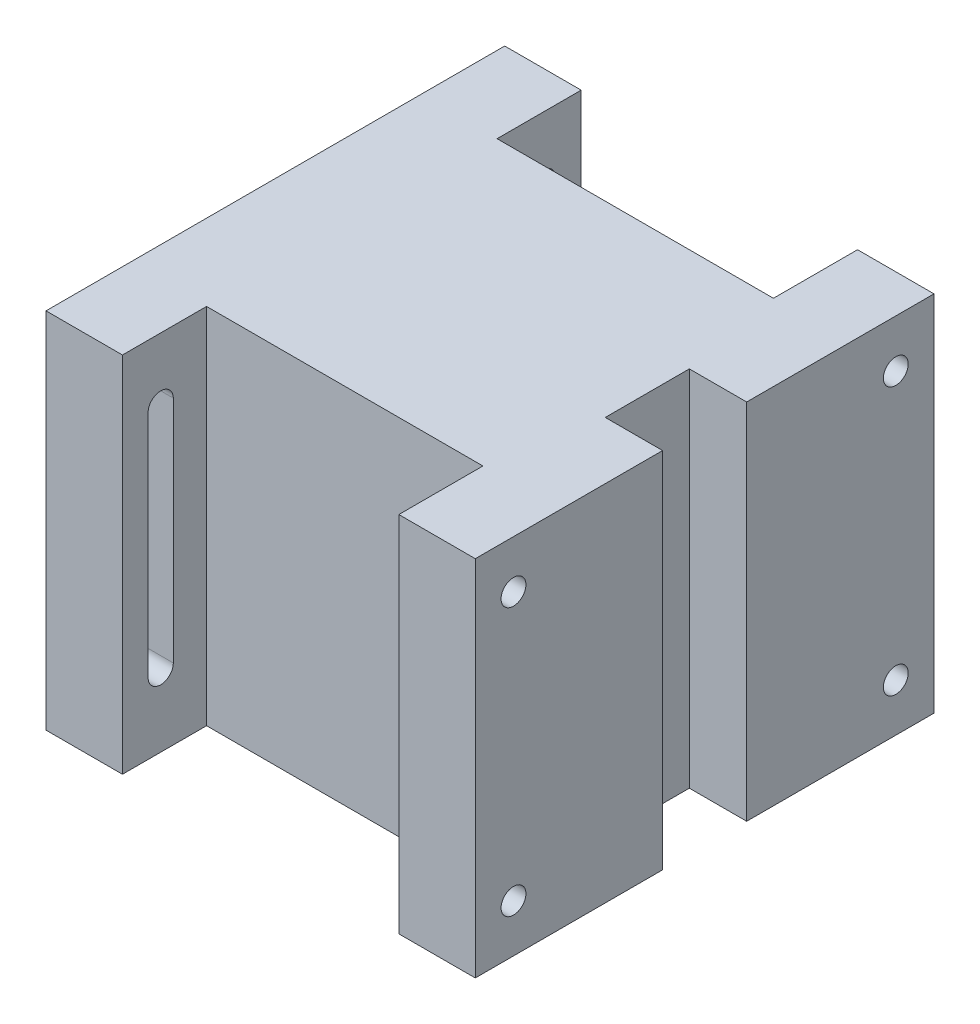
ISO-10303-21;
HEADER;
FILE_DESCRIPTION(('STEP AP214'),'2;1');
FILE_NAME('part.step','',(''),(''),'','','');
FILE_SCHEMA(('AUTOMOTIVE_DESIGN { 1 0 10303 214 1 1 1 1 }'));
ENDSEC;
DATA;
#1=APPLICATION_CONTEXT('core data for automotive mechanical design processes');
#2=APPLICATION_PROTOCOL_DEFINITION('international standard','automotive_design',2000,#1);
#3=PRODUCT_CONTEXT('',#1,'mechanical');
#4=PRODUCT('Part','Part','',(#3));
#5=PRODUCT_RELATED_PRODUCT_CATEGORY('part','',(#4));
#6=PRODUCT_DEFINITION_FORMATION('','',#4);
#7=PRODUCT_DEFINITION_CONTEXT('part definition',#1,'design');
#8=PRODUCT_DEFINITION('design','',#6,#7);
#9=PRODUCT_DEFINITION_SHAPE('','',#8);
#10=(LENGTH_UNIT() NAMED_UNIT(*) SI_UNIT(.MILLI.,.METRE.));
#11=(NAMED_UNIT(*) PLANE_ANGLE_UNIT() SI_UNIT($,.RADIAN.));
#12=(NAMED_UNIT(*) SI_UNIT($,.STERADIAN.) SOLID_ANGLE_UNIT());
#13=UNCERTAINTY_MEASURE_WITH_UNIT(LENGTH_MEASURE(1.E-05),#10,'distance_accuracy_value','');
#14=(GEOMETRIC_REPRESENTATION_CONTEXT(3) GLOBAL_UNCERTAINTY_ASSIGNED_CONTEXT((#13)) GLOBAL_UNIT_ASSIGNED_CONTEXT((#10,
#11,#12)) REPRESENTATION_CONTEXT('',''));
#15=CARTESIAN_POINT('',(0.,0.,0.));
#16=DIRECTION('',(0.,0.,1.));
#17=DIRECTION('',(1.,0.,0.));
#18=AXIS2_PLACEMENT_3D('',#15,#16,#17);
#19=CARTESIAN_POINT('',(112.3,0.,120.));
#20=DIRECTION('',(-1.,0.,0.));
#21=DIRECTION('',(0.,0.,1.));
#22=AXIS2_PLACEMENT_3D('',#19,#20,#21);
#23=PLANE('',#22);
#24=CARTESIAN_POINT('',(112.3,82.5,10.));
#25=DIRECTION('',(1.,0.,0.));
#26=DIRECTION('',(0.,0.,1.));
#27=AXIS2_PLACEMENT_3D('',#24,#25,#26);
#28=CIRCLE('',#27,3.25);
#29=CARTESIAN_POINT('',(112.3,82.5,13.25));
#30=VERTEX_POINT('',#29);
#31=EDGE_CURVE('E232',#30,#30,#28,.T.);
#32=ORIENTED_EDGE('',*,*,#31,.F.);
#33=EDGE_LOOP('',(#32));
#34=FACE_BOUND('',#33,.T.);
#35=CARTESIAN_POINT('',(112.3,12.5,9.99999999999999));
#36=DIRECTION('',(1.,0.,0.));
#37=DIRECTION('',(0.,0.,-1.));
#38=AXIS2_PLACEMENT_3D('',#35,#36,#37);
#39=CIRCLE('',#38,3.25);
#40=CARTESIAN_POINT('',(112.3,12.5,6.74999999999999));
#41=VERTEX_POINT('',#40);
#42=EDGE_CURVE('E228',#41,#41,#39,.T.);
#43=ORIENTED_EDGE('',*,*,#42,.F.);
#44=EDGE_LOOP('',(#43));
#45=FACE_BOUND('',#44,.T.);
#46=DIRECTION('',(0.,0.,-1.));
#47=VECTOR('',#46,1.);
#48=CARTESIAN_POINT('',(112.3,95.,120.));
#49=LINE('',#48,#47);
#50=CARTESIAN_POINT('',(112.3,95.,49.));
#51=VERTEX_POINT('',#50);
#52=CARTESIAN_POINT('',(112.3,95.,0.));
#53=VERTEX_POINT('',#52);
#54=EDGE_CURVE('E360',#51,#53,#49,.T.);
#55=ORIENTED_EDGE('',*,*,#54,.F.);
#56=DIRECTION('',(0.,1.,0.));
#57=VECTOR('',#56,1.);
#58=CARTESIAN_POINT('',(112.3,95.,49.));
#59=LINE('',#58,#57);
#60=CARTESIAN_POINT('',(112.3,0.,49.));
#61=VERTEX_POINT('',#60);
#62=EDGE_CURVE('E451',#61,#51,#59,.T.);
#63=ORIENTED_EDGE('',*,*,#62,.F.);
#64=DIRECTION('',(0.,0.,-1.));
#65=VECTOR('',#64,1.);
#66=CARTESIAN_POINT('',(112.3,0.,120.));
#67=LINE('',#66,#65);
#68=CARTESIAN_POINT('',(112.3,0.,0.));
#69=VERTEX_POINT('',#68);
#70=EDGE_CURVE('E362',#61,#69,#67,.T.);
#71=ORIENTED_EDGE('',*,*,#70,.T.);
#72=DIRECTION('',(0.,1.,0.));
#73=VECTOR('',#72,1.);
#74=CARTESIAN_POINT('',(112.3,0.,0.));
#75=LINE('',#74,#73);
#76=EDGE_CURVE('E352',#69,#53,#75,.T.);
#77=ORIENTED_EDGE('',*,*,#76,.T.);
#78=EDGE_LOOP('',(#55,#63,#71,#77));
#79=FACE_BOUND('',#78,.T.);
#80=ADVANCED_FACE('F33',(#34,#45,#79),#23,.F.);
#81=CARTESIAN_POINT('',(0.,95.,0.));
#82=DIRECTION('',(0.,0.,-1.));
#83=DIRECTION('',(-1.,0.,0.));
#84=AXIS2_PLACEMENT_3D('',#81,#82,#83);
#85=PLANE('',#84);
#86=DIRECTION('',(0.,-1.,0.));
#87=VECTOR('',#86,1.);
#88=CARTESIAN_POINT('',(20.,95.,0.));
#89=LINE('',#88,#87);
#90=CARTESIAN_POINT('',(20.,95.,0.));
#91=VERTEX_POINT('',#90);
#92=CARTESIAN_POINT('',(20.,0.,0.));
#93=VERTEX_POINT('',#92);
#94=EDGE_CURVE('E296',#91,#93,#89,.T.);
#95=ORIENTED_EDGE('',*,*,#94,.T.);
#96=DIRECTION('',(1.,0.,0.));
#97=VECTOR('',#96,1.);
#98=CARTESIAN_POINT('',(0.,0.,0.));
#99=LINE('',#98,#97);
#100=CARTESIAN_POINT('',(0.,0.,0.));
#101=VERTEX_POINT('',#100);
#102=EDGE_CURVE('E349',#101,#93,#99,.T.);
#103=ORIENTED_EDGE('',*,*,#102,.F.);
#104=DIRECTION('',(0.,-1.,0.));
#105=VECTOR('',#104,1.);
#106=CARTESIAN_POINT('',(0.,0.,0.));
#107=LINE('',#106,#105);
#108=CARTESIAN_POINT('',(0.,95.,0.));
#109=VERTEX_POINT('',#108);
#110=EDGE_CURVE('E324',#109,#101,#107,.T.);
#111=ORIENTED_EDGE('',*,*,#110,.F.);
#112=DIRECTION('',(-1.,0.,0.));
#113=VECTOR('',#112,1.);
#114=CARTESIAN_POINT('',(0.,95.,0.));
#115=LINE('',#114,#113);
#116=EDGE_CURVE('E355',#91,#109,#115,.T.);
#117=ORIENTED_EDGE('',*,*,#116,.F.);
#118=EDGE_LOOP('',(#95,#103,#111,#117));
#119=FACE_BOUND('',#118,.T.);
#120=ADVANCED_FACE('F415',(#119),#85,.T.);
#121=CARTESIAN_POINT('',(0.,95.,120.));
#122=DIRECTION('',(0.,0.,-1.));
#123=DIRECTION('',(-1.,0.,0.));
#124=AXIS2_PLACEMENT_3D('',#121,#122,#123);
#125=PLANE('',#124);
#126=DIRECTION('',(-1.,0.,0.));
#127=VECTOR('',#126,1.);
#128=CARTESIAN_POINT('',(0.,95.,120.));
#129=LINE('',#128,#127);
#130=CARTESIAN_POINT('',(112.3,95.,120.));
#131=VERTEX_POINT('',#130);
#132=CARTESIAN_POINT('',(92.3,95.,120.));
#133=VERTEX_POINT('',#132);
#134=EDGE_CURVE('E342',#131,#133,#129,.T.);
#135=ORIENTED_EDGE('',*,*,#134,.T.);
#136=DIRECTION('',(0.,-1.,0.));
#137=VECTOR('',#136,1.);
#138=CARTESIAN_POINT('',(92.3,95.,120.));
#139=LINE('',#138,#137);
#140=CARTESIAN_POINT('',(92.3,0.,120.));
#141=VERTEX_POINT('',#140);
#142=EDGE_CURVE('E315',#133,#141,#139,.T.);
#143=ORIENTED_EDGE('',*,*,#142,.T.);
#144=DIRECTION('',(1.,0.,0.));
#145=VECTOR('',#144,1.);
#146=CARTESIAN_POINT('',(0.,0.,120.));
#147=LINE('',#146,#145);
#148=CARTESIAN_POINT('',(112.3,0.,120.));
#149=VERTEX_POINT('',#148);
#150=EDGE_CURVE('E334',#141,#149,#147,.T.);
#151=ORIENTED_EDGE('',*,*,#150,.T.);
#152=DIRECTION('',(0.,1.,0.));
#153=VECTOR('',#152,1.);
#154=CARTESIAN_POINT('',(112.3,0.,120.));
#155=LINE('',#154,#153);
#156=EDGE_CURVE('E339',#149,#131,#155,.T.);
#157=ORIENTED_EDGE('',*,*,#156,.T.);
#158=EDGE_LOOP('',(#135,#143,#151,#157));
#159=FACE_BOUND('',#158,.T.);
#160=ADVANCED_FACE('F422',(#159),#125,.F.);
#161=CARTESIAN_POINT('',(0.,0.,120.));
#162=DIRECTION('',(1.,0.,0.));
#163=DIRECTION('',(0.,0.,-1.));
#164=AXIS2_PLACEMENT_3D('',#161,#162,#163);
#165=PLANE('',#164);
#166=DIRECTION('',(0.,1.,0.));
#167=VECTOR('',#166,1.);
#168=CARTESIAN_POINT('',(0.,18.5769602174339,13.3));
#169=LINE('',#168,#167);
#170=CARTESIAN_POINT('',(0.,18.5769602174339,13.3));
#171=VERTEX_POINT('',#170);
#172=CARTESIAN_POINT('',(0.,78.5769602174339,13.3));
#173=VERTEX_POINT('',#172);
#174=EDGE_CURVE('E241',#171,#173,#169,.T.);
#175=ORIENTED_EDGE('',*,*,#174,.F.);
#176=CARTESIAN_POINT('',(0.,18.5769602174339,9.99999999999999));
#177=DIRECTION('',(-1.,0.,0.));
#178=DIRECTION('',(0.,0.,-1.));
#179=AXIS2_PLACEMENT_3D('',#176,#177,#178);
#180=CIRCLE('',#179,3.3);
#181=CARTESIAN_POINT('',(0.,18.5769602174339,6.7));
#182=VERTEX_POINT('',#181);
#183=EDGE_CURVE('E58',#182,#171,#180,.T.);
#184=ORIENTED_EDGE('',*,*,#183,.F.);
#185=DIRECTION('',(0.,-1.,0.));
#186=VECTOR('',#185,1.);
#187=CARTESIAN_POINT('',(0.,18.5769602174339,6.7));
#188=LINE('',#187,#186);
#189=CARTESIAN_POINT('',(0.,78.5769602174339,6.7));
#190=VERTEX_POINT('',#189);
#191=EDGE_CURVE('E247',#190,#182,#188,.T.);
#192=ORIENTED_EDGE('',*,*,#191,.F.);
#193=CARTESIAN_POINT('',(0.,78.5769602174339,9.99999999999999));
#194=DIRECTION('',(-1.,0.,0.));
#195=DIRECTION('',(0.,0.,-1.));
#196=AXIS2_PLACEMENT_3D('',#193,#194,#195);
#197=CIRCLE('',#196,3.3);
#198=EDGE_CURVE('E244',#173,#190,#197,.T.);
#199=ORIENTED_EDGE('',*,*,#198,.F.);
#200=EDGE_LOOP('',(#175,#184,#192,#199));
#201=FACE_BOUND('',#200,.T.);
#202=DIRECTION('',(0.,1.,0.));
#203=VECTOR('',#202,1.);
#204=CARTESIAN_POINT('',(0.,18.5769602174339,113.3));
#205=LINE('',#204,#203);
#206=CARTESIAN_POINT('',(0.,18.5769602174339,113.3));
#207=VERTEX_POINT('',#206);
#208=CARTESIAN_POINT('',(0.,78.5769602174339,113.3));
#209=VERTEX_POINT('',#208);
#210=EDGE_CURVE('E260',#207,#209,#205,.T.);
#211=ORIENTED_EDGE('',*,*,#210,.F.);
#212=CARTESIAN_POINT('',(0.,18.5769602174339,110.));
#213=DIRECTION('',(-1.,0.,0.));
#214=DIRECTION('',(0.,0.,1.));
#215=AXIS2_PLACEMENT_3D('',#212,#213,#214);
#216=CIRCLE('',#215,3.3);
#217=CARTESIAN_POINT('',(0.,18.5769602174339,106.7));
#218=VERTEX_POINT('',#217);
#219=EDGE_CURVE('E253',#218,#207,#216,.T.);
#220=ORIENTED_EDGE('',*,*,#219,.F.);
#221=DIRECTION('',(0.,-1.,0.));
#222=VECTOR('',#221,1.);
#223=CARTESIAN_POINT('',(0.,18.5769602174339,106.7));
#224=LINE('',#223,#222);
#225=CARTESIAN_POINT('',(0.,78.5769602174339,106.7));
#226=VERTEX_POINT('',#225);
#227=EDGE_CURVE('E266',#226,#218,#224,.T.);
#228=ORIENTED_EDGE('',*,*,#227,.F.);
#229=CARTESIAN_POINT('',(0.,78.5769602174339,110.));
#230=DIRECTION('',(-1.,0.,0.));
#231=DIRECTION('',(0.,0.,1.));
#232=AXIS2_PLACEMENT_3D('',#229,#230,#231);
#233=CIRCLE('',#232,3.3);
#234=EDGE_CURVE('E263',#209,#226,#233,.T.);
#235=ORIENTED_EDGE('',*,*,#234,.F.);
#236=EDGE_LOOP('',(#211,#220,#228,#235));
#237=FACE_BOUND('',#236,.T.);
#238=ORIENTED_EDGE('',*,*,#110,.T.);
#239=DIRECTION('',(0.,0.,-1.));
#240=VECTOR('',#239,1.);
#241=CARTESIAN_POINT('',(0.,0.,120.));
#242=LINE('',#241,#240);
#243=CARTESIAN_POINT('',(0.,0.,120.));
#244=VERTEX_POINT('',#243);
#245=EDGE_CURVE('E366',#244,#101,#242,.T.);
#246=ORIENTED_EDGE('',*,*,#245,.F.);
#247=DIRECTION('',(0.,-1.,0.));
#248=VECTOR('',#247,1.);
#249=CARTESIAN_POINT('',(0.,0.,120.));
#250=LINE('',#249,#248);
#251=CARTESIAN_POINT('',(0.,95.,120.));
#252=VERTEX_POINT('',#251);
#253=EDGE_CURVE('E331',#252,#244,#250,.T.);
#254=ORIENTED_EDGE('',*,*,#253,.F.);
#255=DIRECTION('',(0.,0.,-1.));
#256=VECTOR('',#255,1.);
#257=CARTESIAN_POINT('',(0.,95.,120.));
#258=LINE('',#257,#256);
#259=EDGE_CURVE('E345',#252,#109,#258,.T.);
#260=ORIENTED_EDGE('',*,*,#259,.T.);
#261=EDGE_LOOP('',(#238,#246,#254,#260));
#262=FACE_BOUND('',#261,.T.);
#263=ADVANCED_FACE('F35',(#201,#237,#262),#165,.F.);
#264=CARTESIAN_POINT('',(0.,0.,120.));
#265=DIRECTION('',(0.,1.,0.));
#266=DIRECTION('',(0.,0.,1.));
#267=AXIS2_PLACEMENT_3D('',#264,#265,#266);
#268=PLANE('',#267);
#269=ORIENTED_EDGE('',*,*,#70,.F.);
#270=DIRECTION('',(1.,0.,0.));
#271=VECTOR('',#270,1.);
#272=CARTESIAN_POINT('',(97.3,0.,49.));
#273=LINE('',#272,#271);
#274=CARTESIAN_POINT('',(97.3,0.,49.));
#275=VERTEX_POINT('',#274);
#276=EDGE_CURVE('E220',#275,#61,#273,.T.);
#277=ORIENTED_EDGE('',*,*,#276,.F.);
#278=DIRECTION('',(0.,0.,-1.));
#279=VECTOR('',#278,1.);
#280=CARTESIAN_POINT('',(97.3,0.,49.));
#281=LINE('',#280,#279);
#282=CARTESIAN_POINT('',(97.3,0.,71.));
#283=VERTEX_POINT('',#282);
#284=EDGE_CURVE('E205',#283,#275,#281,.T.);
#285=ORIENTED_EDGE('',*,*,#284,.F.);
#286=DIRECTION('',(1.,0.,0.));
#287=VECTOR('',#286,1.);
#288=CARTESIAN_POINT('',(97.3,0.,71.));
#289=LINE('',#288,#287);
#290=CARTESIAN_POINT('',(112.3,0.,71.));
#291=VERTEX_POINT('',#290);
#292=EDGE_CURVE('E203',#283,#291,#289,.T.);
#293=ORIENTED_EDGE('',*,*,#292,.T.);
#294=EDGE_CURVE('E363',#149,#291,#67,.T.);
#295=ORIENTED_EDGE('',*,*,#294,.F.);
#296=ORIENTED_EDGE('',*,*,#150,.F.);
#297=DIRECTION('',(0.,0.,1.));
#298=VECTOR('',#297,1.);
#299=CARTESIAN_POINT('',(92.3,0.,120.));
#300=LINE('',#299,#298);
#301=CARTESIAN_POINT('',(92.3,0.,98.));
#302=VERTEX_POINT('',#301);
#303=EDGE_CURVE('E299',#302,#141,#300,.T.);
#304=ORIENTED_EDGE('',*,*,#303,.F.);
#305=DIRECTION('',(1.,0.,0.));
#306=VECTOR('',#305,1.);
#307=CARTESIAN_POINT('',(92.3,0.,98.));
#308=LINE('',#307,#306);
#309=CARTESIAN_POINT('',(20.,0.,98.));
#310=VERTEX_POINT('',#309);
#311=EDGE_CURVE('E309',#310,#302,#308,.T.);
#312=ORIENTED_EDGE('',*,*,#311,.F.);
#313=DIRECTION('',(0.,0.,-1.));
#314=VECTOR('',#313,1.);
#315=CARTESIAN_POINT('',(20.,0.,120.));
#316=LINE('',#315,#314);
#317=CARTESIAN_POINT('',(20.,0.,120.));
#318=VERTEX_POINT('',#317);
#319=EDGE_CURVE('E317',#318,#310,#316,.T.);
#320=ORIENTED_EDGE('',*,*,#319,.F.);
#321=EDGE_CURVE('E336',#244,#318,#147,.T.);
#322=ORIENTED_EDGE('',*,*,#321,.F.);
#323=ORIENTED_EDGE('',*,*,#245,.T.);
#324=ORIENTED_EDGE('',*,*,#102,.T.);
#325=DIRECTION('',(0.,0.,-1.));
#326=VECTOR('',#325,1.);
#327=CARTESIAN_POINT('',(20.,0.,0.));
#328=LINE('',#327,#326);
#329=CARTESIAN_POINT('',(20.,0.,22.));
#330=VERTEX_POINT('',#329);
#331=EDGE_CURVE('E283',#330,#93,#328,.T.);
#332=ORIENTED_EDGE('',*,*,#331,.F.);
#333=DIRECTION('',(-1.,0.,0.));
#334=VECTOR('',#333,1.);
#335=CARTESIAN_POINT('',(92.3,0.,22.));
#336=LINE('',#335,#334);
#337=CARTESIAN_POINT('',(92.3,0.,22.));
#338=VERTEX_POINT('',#337);
#339=EDGE_CURVE('E292',#338,#330,#336,.T.);
#340=ORIENTED_EDGE('',*,*,#339,.F.);
#341=DIRECTION('',(0.,0.,1.));
#342=VECTOR('',#341,1.);
#343=CARTESIAN_POINT('',(92.3,0.,0.));
#344=LINE('',#343,#342);
#345=CARTESIAN_POINT('',(92.3,0.,0.));
#346=VERTEX_POINT('',#345);
#347=EDGE_CURVE('E272',#346,#338,#344,.T.);
#348=ORIENTED_EDGE('',*,*,#347,.F.);
#349=EDGE_CURVE('E348',#346,#69,#99,.T.);
#350=ORIENTED_EDGE('',*,*,#349,.T.);
#351=EDGE_LOOP('',(#269,#277,#285,#293,#295,#296,#304,#312,#320,#322,#323,#324,#332,#340,#348,#350));
#352=FACE_BOUND('',#351,.T.);
#353=ADVANCED_FACE('F430',(#352),#268,.F.);
#354=CARTESIAN_POINT('',(112.3,12.5,110.));
#355=DIRECTION('',(1.,0.,0.));
#356=DIRECTION('',(0.,0.,1.));
#357=AXIS2_PLACEMENT_3D('',#354,#355,#356);
#358=CIRCLE('',#357,3.25000000000001);
#359=CARTESIAN_POINT('',(112.3,12.5,113.25));
#360=VERTEX_POINT('',#359);
#361=EDGE_CURVE('E225',#360,#360,#358,.T.);
#362=ORIENTED_EDGE('',*,*,#361,.F.);
#363=EDGE_LOOP('',(#362));
#364=FACE_BOUND('',#363,.T.);
#365=CARTESIAN_POINT('',(112.3,82.5,110.));
#366=DIRECTION('',(1.,0.,0.));
#367=DIRECTION('',(0.,0.,-1.));
#368=AXIS2_PLACEMENT_3D('',#365,#366,#367);
#369=CIRCLE('',#368,3.25000000000001);
#370=CARTESIAN_POINT('',(112.3,82.5,106.75));
#371=VERTEX_POINT('',#370);
#372=EDGE_CURVE('E236',#371,#371,#369,.T.);
#373=ORIENTED_EDGE('',*,*,#372,.F.);
#374=EDGE_LOOP('',(#373));
#375=FACE_BOUND('',#374,.T.);
#376=ORIENTED_EDGE('',*,*,#294,.T.);
#377=DIRECTION('',(0.,-1.,0.));
#378=VECTOR('',#377,1.);
#379=CARTESIAN_POINT('',(112.3,95.,71.));
#380=LINE('',#379,#378);
#381=CARTESIAN_POINT('',(112.3,95.,71.));
#382=VERTEX_POINT('',#381);
#383=EDGE_CURVE('E444',#382,#291,#380,.T.);
#384=ORIENTED_EDGE('',*,*,#383,.F.);
#385=EDGE_CURVE('E217',#131,#382,#49,.T.);
#386=ORIENTED_EDGE('',*,*,#385,.F.);
#387=ORIENTED_EDGE('',*,*,#156,.F.);
#388=EDGE_LOOP('',(#376,#384,#386,#387));
#389=FACE_BOUND('',#388,.T.);
#390=ADVANCED_FACE('F418',(#364,#375,#389),#23,.F.);
#391=CARTESIAN_POINT('',(0.,95.,120.));
#392=DIRECTION('',(0.,-1.,0.));
#393=DIRECTION('',(0.,0.,-1.));
#394=AXIS2_PLACEMENT_3D('',#391,#392,#393);
#395=PLANE('',#394);
#396=DIRECTION('',(0.,0.,1.));
#397=VECTOR('',#396,1.);
#398=CARTESIAN_POINT('',(97.3,95.,49.));
#399=LINE('',#398,#397);
#400=CARTESIAN_POINT('',(97.3,95.,49.));
#401=VERTEX_POINT('',#400);
#402=CARTESIAN_POINT('',(97.3,95.,71.));
#403=VERTEX_POINT('',#402);
#404=EDGE_CURVE('E206',#401,#403,#399,.T.);
#405=ORIENTED_EDGE('',*,*,#404,.F.);
#406=DIRECTION('',(1.,0.,0.));
#407=VECTOR('',#406,1.);
#408=CARTESIAN_POINT('',(97.3,95.,49.));
#409=LINE('',#408,#407);
#410=EDGE_CURVE('E218',#401,#51,#409,.T.);
#411=ORIENTED_EDGE('',*,*,#410,.T.);
#412=ORIENTED_EDGE('',*,*,#54,.T.);
#413=CARTESIAN_POINT('',(92.3,95.,0.));
#414=VERTEX_POINT('',#413);
#415=EDGE_CURVE('E335',#53,#414,#115,.T.);
#416=ORIENTED_EDGE('',*,*,#415,.T.);
#417=DIRECTION('',(0.,0.,1.));
#418=VECTOR('',#417,1.);
#419=CARTESIAN_POINT('',(92.3,95.,0.));
#420=LINE('',#419,#418);
#421=CARTESIAN_POINT('',(92.3,95.,22.));
#422=VERTEX_POINT('',#421);
#423=EDGE_CURVE('E279',#414,#422,#420,.T.);
#424=ORIENTED_EDGE('',*,*,#423,.T.);
#425=DIRECTION('',(-1.,0.,0.));
#426=VECTOR('',#425,1.);
#427=CARTESIAN_POINT('',(92.3,95.,22.));
#428=LINE('',#427,#426);
#429=CARTESIAN_POINT('',(20.,95.,22.));
#430=VERTEX_POINT('',#429);
#431=EDGE_CURVE('E282',#422,#430,#428,.T.);
#432=ORIENTED_EDGE('',*,*,#431,.T.);
#433=DIRECTION('',(0.,0.,-1.));
#434=VECTOR('',#433,1.);
#435=CARTESIAN_POINT('',(20.,95.,0.));
#436=LINE('',#435,#434);
#437=EDGE_CURVE('E286',#430,#91,#436,.T.);
#438=ORIENTED_EDGE('',*,*,#437,.T.);
#439=ORIENTED_EDGE('',*,*,#116,.T.);
#440=ORIENTED_EDGE('',*,*,#259,.F.);
#441=CARTESIAN_POINT('',(20.,95.,120.));
#442=VERTEX_POINT('',#441);
#443=EDGE_CURVE('E341',#442,#252,#129,.T.);
#444=ORIENTED_EDGE('',*,*,#443,.F.);
#445=DIRECTION('',(0.,0.,-1.));
#446=VECTOR('',#445,1.);
#447=CARTESIAN_POINT('',(20.,95.,120.));
#448=LINE('',#447,#446);
#449=CARTESIAN_POINT('',(20.,95.,98.));
#450=VERTEX_POINT('',#449);
#451=EDGE_CURVE('E308',#442,#450,#448,.T.);
#452=ORIENTED_EDGE('',*,*,#451,.T.);
#453=DIRECTION('',(1.,0.,0.));
#454=VECTOR('',#453,1.);
#455=CARTESIAN_POINT('',(92.3,95.,98.));
#456=LINE('',#455,#454);
#457=CARTESIAN_POINT('',(92.3,95.,98.));
#458=VERTEX_POINT('',#457);
#459=EDGE_CURVE('E312',#450,#458,#456,.T.);
#460=ORIENTED_EDGE('',*,*,#459,.T.);
#461=DIRECTION('',(0.,0.,1.));
#462=VECTOR('',#461,1.);
#463=CARTESIAN_POINT('',(92.3,95.,120.));
#464=LINE('',#463,#462);
#465=EDGE_CURVE('E305',#458,#133,#464,.T.);
#466=ORIENTED_EDGE('',*,*,#465,.T.);
#467=ORIENTED_EDGE('',*,*,#134,.F.);
#468=ORIENTED_EDGE('',*,*,#385,.T.);
#469=DIRECTION('',(1.,0.,0.));
#470=VECTOR('',#469,1.);
#471=CARTESIAN_POINT('',(97.3,95.,71.));
#472=LINE('',#471,#470);
#473=EDGE_CURVE('E200',#403,#382,#472,.T.);
#474=ORIENTED_EDGE('',*,*,#473,.F.);
#475=EDGE_LOOP('',(#405,#411,#412,#416,#424,#432,#438,#439,#440,#444,#452,#460,#466,#467,#468,#474));
#476=FACE_BOUND('',#475,.T.);
#477=ADVANCED_FACE('F214',(#476),#395,.F.);
#478=ORIENTED_EDGE('',*,*,#321,.T.);
#479=DIRECTION('',(0.,-1.,0.));
#480=VECTOR('',#479,1.);
#481=CARTESIAN_POINT('',(20.,95.,120.));
#482=LINE('',#481,#480);
#483=EDGE_CURVE('E327',#442,#318,#482,.T.);
#484=ORIENTED_EDGE('',*,*,#483,.F.);
#485=ORIENTED_EDGE('',*,*,#443,.T.);
#486=ORIENTED_EDGE('',*,*,#253,.T.);
#487=EDGE_LOOP('',(#478,#484,#485,#486));
#488=FACE_BOUND('',#487,.T.);
#489=ADVANCED_FACE('F436',(#488),#125,.F.);
#490=DIRECTION('',(0.,-1.,0.));
#491=VECTOR('',#490,1.);
#492=CARTESIAN_POINT('',(92.3,95.,0.));
#493=LINE('',#492,#491);
#494=EDGE_CURVE('E289',#414,#346,#493,.T.);
#495=ORIENTED_EDGE('',*,*,#494,.F.);
#496=ORIENTED_EDGE('',*,*,#415,.F.);
#497=ORIENTED_EDGE('',*,*,#76,.F.);
#498=ORIENTED_EDGE('',*,*,#349,.F.);
#499=EDGE_LOOP('',(#495,#496,#497,#498));
#500=FACE_BOUND('',#499,.T.);
#501=ADVANCED_FACE('F425',(#500),#85,.T.);
#502=CARTESIAN_POINT('',(92.3,95.,120.));
#503=DIRECTION('',(1.,0.,0.));
#504=DIRECTION('',(0.,0.,-1.));
#505=AXIS2_PLACEMENT_3D('',#502,#503,#504);
#506=PLANE('',#505);
#507=CARTESIAN_POINT('',(92.3,12.5,110.));
#508=DIRECTION('',(1.,0.,0.));
#509=DIRECTION('',(0.,0.,-1.));
#510=AXIS2_PLACEMENT_3D('',#507,#508,#509);
#511=CIRCLE('',#510,3.25000000000001);
#512=CARTESIAN_POINT('',(92.3,12.5,106.75));
#513=VERTEX_POINT('',#512);
#514=EDGE_CURVE('E37',#513,#513,#511,.T.);
#515=ORIENTED_EDGE('',*,*,#514,.T.);
#516=EDGE_LOOP('',(#515));
#517=FACE_BOUND('',#516,.T.);
#518=CARTESIAN_POINT('',(92.3,82.5,110.));
#519=DIRECTION('',(1.,0.,0.));
#520=DIRECTION('',(0.,0.,-1.));
#521=AXIS2_PLACEMENT_3D('',#518,#519,#520);
#522=CIRCLE('',#521,3.25000000000001);
#523=CARTESIAN_POINT('',(92.3,82.5,106.75));
#524=VERTEX_POINT('',#523);
#525=EDGE_CURVE('E239',#524,#524,#522,.T.);
#526=ORIENTED_EDGE('',*,*,#525,.T.);
#527=EDGE_LOOP('',(#526));
#528=FACE_BOUND('',#527,.T.);
#529=ORIENTED_EDGE('',*,*,#303,.T.);
#530=ORIENTED_EDGE('',*,*,#142,.F.);
#531=ORIENTED_EDGE('',*,*,#465,.F.);
#532=DIRECTION('',(0.,-1.,0.));
#533=VECTOR('',#532,1.);
#534=CARTESIAN_POINT('',(92.3,95.,98.));
#535=LINE('',#534,#533);
#536=EDGE_CURVE('E322',#458,#302,#535,.T.);
#537=ORIENTED_EDGE('',*,*,#536,.T.);
#538=EDGE_LOOP('',(#529,#530,#531,#537));
#539=FACE_BOUND('',#538,.T.);
#540=ADVANCED_FACE('F492',(#517,#528,#539),#506,.F.);
#541=CARTESIAN_POINT('',(92.3,95.,98.));
#542=DIRECTION('',(0.,0.,-1.));
#543=DIRECTION('',(-1.,0.,0.));
#544=AXIS2_PLACEMENT_3D('',#541,#542,#543);
#545=PLANE('',#544);
#546=ORIENTED_EDGE('',*,*,#311,.T.);
#547=ORIENTED_EDGE('',*,*,#536,.F.);
#548=ORIENTED_EDGE('',*,*,#459,.F.);
#549=DIRECTION('',(0.,-1.,0.));
#550=VECTOR('',#549,1.);
#551=CARTESIAN_POINT('',(20.,95.,98.));
#552=LINE('',#551,#550);
#553=EDGE_CURVE('E325',#450,#310,#552,.T.);
#554=ORIENTED_EDGE('',*,*,#553,.T.);
#555=EDGE_LOOP('',(#546,#547,#548,#554));
#556=FACE_BOUND('',#555,.T.);
#557=ADVANCED_FACE('F487',(#556),#545,.F.);
#558=CARTESIAN_POINT('',(20.,95.,120.));
#559=DIRECTION('',(-1.,0.,0.));
#560=DIRECTION('',(0.,0.,1.));
#561=AXIS2_PLACEMENT_3D('',#558,#559,#560);
#562=PLANE('',#561);
#563=DIRECTION('',(0.,-1.,0.));
#564=VECTOR('',#563,1.);
#565=CARTESIAN_POINT('',(20.,95.,106.7));
#566=LINE('',#565,#564);
#567=CARTESIAN_POINT('',(20.,78.5769602174339,106.7));
#568=VERTEX_POINT('',#567);
#569=CARTESIAN_POINT('',(20.,18.5769602174339,106.7));
#570=VERTEX_POINT('',#569);
#571=EDGE_CURVE('E375',#568,#570,#566,.T.);
#572=ORIENTED_EDGE('',*,*,#571,.T.);
#573=CARTESIAN_POINT('',(20.,18.5769602174339,110.));
#574=DIRECTION('',(-1.,0.,0.));
#575=DIRECTION('',(0.,0.,1.));
#576=AXIS2_PLACEMENT_3D('',#573,#574,#575);
#577=CIRCLE('',#576,3.3);
#578=CARTESIAN_POINT('',(20.,18.5769602174339,113.3));
#579=VERTEX_POINT('',#578);
#580=EDGE_CURVE('E378',#570,#579,#577,.T.);
#581=ORIENTED_EDGE('',*,*,#580,.T.);
#582=DIRECTION('',(0.,1.,0.));
#583=VECTOR('',#582,1.);
#584=CARTESIAN_POINT('',(20.,95.,113.3));
#585=LINE('',#584,#583);
#586=CARTESIAN_POINT('',(20.,78.5769602174339,113.3));
#587=VERTEX_POINT('',#586);
#588=EDGE_CURVE('E369',#579,#587,#585,.T.);
#589=ORIENTED_EDGE('',*,*,#588,.T.);
#590=CARTESIAN_POINT('',(20.,78.5769602174339,110.));
#591=DIRECTION('',(-1.,0.,0.));
#592=DIRECTION('',(0.,0.,1.));
#593=AXIS2_PLACEMENT_3D('',#590,#591,#592);
#594=CIRCLE('',#593,3.3);
#595=EDGE_CURVE('E372',#587,#568,#594,.T.);
#596=ORIENTED_EDGE('',*,*,#595,.T.);
#597=EDGE_LOOP('',(#572,#581,#589,#596));
#598=FACE_BOUND('',#597,.T.);
#599=ORIENTED_EDGE('',*,*,#319,.T.);
#600=ORIENTED_EDGE('',*,*,#553,.F.);
#601=ORIENTED_EDGE('',*,*,#451,.F.);
#602=ORIENTED_EDGE('',*,*,#483,.T.);
#603=EDGE_LOOP('',(#599,#600,#601,#602));
#604=FACE_BOUND('',#603,.T.);
#605=ADVANCED_FACE('F484',(#598,#604),#562,.F.);
#606=CARTESIAN_POINT('',(20.,95.,0.));
#607=DIRECTION('',(-1.,0.,0.));
#608=DIRECTION('',(0.,0.,1.));
#609=AXIS2_PLACEMENT_3D('',#606,#607,#608);
#610=PLANE('',#609);
#611=DIRECTION('',(0.,-1.,0.));
#612=VECTOR('',#611,1.);
#613=CARTESIAN_POINT('',(20.,95.,6.7));
#614=LINE('',#613,#612);
#615=CARTESIAN_POINT('',(20.,78.5769602174339,6.7));
#616=VERTEX_POINT('',#615);
#617=CARTESIAN_POINT('',(20.,18.5769602174339,6.7));
#618=VERTEX_POINT('',#617);
#619=EDGE_CURVE('E42',#616,#618,#614,.T.);
#620=ORIENTED_EDGE('',*,*,#619,.T.);
#621=CARTESIAN_POINT('',(20.,18.5769602174339,9.99999999999999));
#622=DIRECTION('',(-1.,0.,0.));
#623=DIRECTION('',(0.,0.,1.));
#624=AXIS2_PLACEMENT_3D('',#621,#622,#623);
#625=CIRCLE('',#624,3.3);
#626=CARTESIAN_POINT('',(20.,18.5769602174339,13.3));
#627=VERTEX_POINT('',#626);
#628=EDGE_CURVE('E11',#618,#627,#625,.T.);
#629=ORIENTED_EDGE('',*,*,#628,.T.);
#630=DIRECTION('',(0.,1.,0.));
#631=VECTOR('',#630,1.);
#632=CARTESIAN_POINT('',(20.,95.,13.3));
#633=LINE('',#632,#631);
#634=CARTESIAN_POINT('',(20.,78.5769602174339,13.3));
#635=VERTEX_POINT('',#634);
#636=EDGE_CURVE('E381',#627,#635,#633,.T.);
#637=ORIENTED_EDGE('',*,*,#636,.T.);
#638=CARTESIAN_POINT('',(20.,78.5769602174339,9.99999999999999));
#639=DIRECTION('',(-1.,0.,0.));
#640=DIRECTION('',(0.,0.,1.));
#641=AXIS2_PLACEMENT_3D('',#638,#639,#640);
#642=CIRCLE('',#641,3.3);
#643=EDGE_CURVE('E384',#635,#616,#642,.T.);
#644=ORIENTED_EDGE('',*,*,#643,.T.);
#645=EDGE_LOOP('',(#620,#629,#637,#644));
#646=FACE_BOUND('',#645,.T.);
#647=ORIENTED_EDGE('',*,*,#331,.T.);
#648=ORIENTED_EDGE('',*,*,#94,.F.);
#649=ORIENTED_EDGE('',*,*,#437,.F.);
#650=DIRECTION('',(0.,-1.,0.));
#651=VECTOR('',#650,1.);
#652=CARTESIAN_POINT('',(20.,95.,22.));
#653=LINE('',#652,#651);
#654=EDGE_CURVE('E300',#430,#330,#653,.T.);
#655=ORIENTED_EDGE('',*,*,#654,.T.);
#656=EDGE_LOOP('',(#647,#648,#649,#655));
#657=FACE_BOUND('',#656,.T.);
#658=ADVANCED_FACE('F472',(#646,#657),#610,.F.);
#659=CARTESIAN_POINT('',(92.3,95.,22.));
#660=DIRECTION('',(0.,0.,1.));
#661=DIRECTION('',(1.,0.,0.));
#662=AXIS2_PLACEMENT_3D('',#659,#660,#661);
#663=PLANE('',#662);
#664=ORIENTED_EDGE('',*,*,#339,.T.);
#665=ORIENTED_EDGE('',*,*,#654,.F.);
#666=ORIENTED_EDGE('',*,*,#431,.F.);
#667=DIRECTION('',(0.,-1.,0.));
#668=VECTOR('',#667,1.);
#669=CARTESIAN_POINT('',(92.3,95.,22.));
#670=LINE('',#669,#668);
#671=EDGE_CURVE('E302',#422,#338,#670,.T.);
#672=ORIENTED_EDGE('',*,*,#671,.T.);
#673=EDGE_LOOP('',(#664,#665,#666,#672));
#674=FACE_BOUND('',#673,.T.);
#675=ADVANCED_FACE('F468',(#674),#663,.F.);
#676=CARTESIAN_POINT('',(92.3,95.,0.));
#677=DIRECTION('',(1.,0.,0.));
#678=DIRECTION('',(0.,0.,-1.));
#679=AXIS2_PLACEMENT_3D('',#676,#677,#678);
#680=PLANE('',#679);
#681=CARTESIAN_POINT('',(92.3,12.5,9.99999999999999));
#682=DIRECTION('',(1.,0.,0.));
#683=DIRECTION('',(0.,0.,-1.));
#684=AXIS2_PLACEMENT_3D('',#681,#682,#683);
#685=CIRCLE('',#684,3.25);
#686=CARTESIAN_POINT('',(92.3,12.5,6.74999999999999));
#687=VERTEX_POINT('',#686);
#688=EDGE_CURVE('E231',#687,#687,#685,.T.);
#689=ORIENTED_EDGE('',*,*,#688,.T.);
#690=EDGE_LOOP('',(#689));
#691=FACE_BOUND('',#690,.T.);
#692=CARTESIAN_POINT('',(92.3,82.5,10.));
#693=DIRECTION('',(1.,0.,0.));
#694=DIRECTION('',(0.,0.,-1.));
#695=AXIS2_PLACEMENT_3D('',#692,#693,#694);
#696=CIRCLE('',#695,3.25);
#697=CARTESIAN_POINT('',(92.3,82.5,6.75));
#698=VERTEX_POINT('',#697);
#699=EDGE_CURVE('E235',#698,#698,#696,.T.);
#700=ORIENTED_EDGE('',*,*,#699,.T.);
#701=EDGE_LOOP('',(#700));
#702=FACE_BOUND('',#701,.T.);
#703=ORIENTED_EDGE('',*,*,#347,.T.);
#704=ORIENTED_EDGE('',*,*,#671,.F.);
#705=ORIENTED_EDGE('',*,*,#423,.F.);
#706=ORIENTED_EDGE('',*,*,#494,.T.);
#707=EDGE_LOOP('',(#703,#704,#705,#706));
#708=FACE_BOUND('',#707,.T.);
#709=ADVANCED_FACE('F395',(#691,#702,#708),#680,.F.);
#710=CARTESIAN_POINT('',(25.,18.5769602174339,110.));
#711=DIRECTION('',(-1.,0.,0.));
#712=DIRECTION('',(0.,0.,1.));
#713=AXIS2_PLACEMENT_3D('',#710,#711,#712);
#714=CYLINDRICAL_SURFACE('',#713,3.3);
#715=DIRECTION('',(-1.,0.,0.));
#716=VECTOR('',#715,1.);
#717=CARTESIAN_POINT('',(25.,18.5769602174339,106.7));
#718=LINE('',#717,#716);
#719=EDGE_CURVE('E270',#570,#218,#718,.T.);
#720=ORIENTED_EDGE('',*,*,#719,.T.);
#721=ORIENTED_EDGE('',*,*,#219,.T.);
#722=DIRECTION('',(-1.,0.,0.));
#723=VECTOR('',#722,1.);
#724=CARTESIAN_POINT('',(25.,18.5769602174339,113.3));
#725=LINE('',#724,#723);
#726=EDGE_CURVE('E269',#579,#207,#725,.T.);
#727=ORIENTED_EDGE('',*,*,#726,.F.);
#728=ORIENTED_EDGE('',*,*,#580,.F.);
#729=EDGE_LOOP('',(#720,#721,#727,#728));
#730=FACE_BOUND('',#729,.T.);
#731=ADVANCED_FACE('F527',(#730),#714,.F.);
#732=CARTESIAN_POINT('',(25.,18.5769602174339,106.7));
#733=DIRECTION('',(0.,0.,-1.));
#734=DIRECTION('',(-1.,0.,0.));
#735=AXIS2_PLACEMENT_3D('',#732,#733,#734);
#736=PLANE('',#735);
#737=DIRECTION('',(-1.,0.,0.));
#738=VECTOR('',#737,1.);
#739=CARTESIAN_POINT('',(25.,78.5769602174339,106.7));
#740=LINE('',#739,#738);
#741=EDGE_CURVE('E273',#568,#226,#740,.T.);
#742=ORIENTED_EDGE('',*,*,#741,.T.);
#743=ORIENTED_EDGE('',*,*,#227,.T.);
#744=ORIENTED_EDGE('',*,*,#719,.F.);
#745=ORIENTED_EDGE('',*,*,#571,.F.);
#746=EDGE_LOOP('',(#742,#743,#744,#745));
#747=FACE_BOUND('',#746,.T.);
#748=ADVANCED_FACE('F532',(#747),#736,.F.);
#749=CARTESIAN_POINT('',(25.,78.5769602174339,110.));
#750=DIRECTION('',(-1.,0.,0.));
#751=DIRECTION('',(0.,0.,1.));
#752=AXIS2_PLACEMENT_3D('',#749,#750,#751);
#753=CYLINDRICAL_SURFACE('',#752,3.3);
#754=DIRECTION('',(-1.,0.,0.));
#755=VECTOR('',#754,1.);
#756=CARTESIAN_POINT('',(25.,78.5769602174339,113.3));
#757=LINE('',#756,#755);
#758=EDGE_CURVE('E275',#587,#209,#757,.T.);
#759=ORIENTED_EDGE('',*,*,#758,.T.);
#760=ORIENTED_EDGE('',*,*,#234,.T.);
#761=ORIENTED_EDGE('',*,*,#741,.F.);
#762=ORIENTED_EDGE('',*,*,#595,.F.);
#763=EDGE_LOOP('',(#759,#760,#761,#762));
#764=FACE_BOUND('',#763,.T.);
#765=ADVANCED_FACE('F534',(#764),#753,.F.);
#766=CARTESIAN_POINT('',(25.,18.5769602174339,113.3));
#767=DIRECTION('',(0.,0.,1.));
#768=DIRECTION('',(1.,0.,0.));
#769=AXIS2_PLACEMENT_3D('',#766,#767,#768);
#770=PLANE('',#769);
#771=ORIENTED_EDGE('',*,*,#726,.T.);
#772=ORIENTED_EDGE('',*,*,#210,.T.);
#773=ORIENTED_EDGE('',*,*,#758,.F.);
#774=ORIENTED_EDGE('',*,*,#588,.F.);
#775=EDGE_LOOP('',(#771,#772,#773,#774));
#776=FACE_BOUND('',#775,.T.);
#777=ADVANCED_FACE('F523',(#776),#770,.F.);
#778=CARTESIAN_POINT('',(25.,18.5769602174339,9.99999999999999));
#779=DIRECTION('',(-1.,0.,0.));
#780=DIRECTION('',(0.,0.,1.));
#781=AXIS2_PLACEMENT_3D('',#778,#779,#780);
#782=CYLINDRICAL_SURFACE('',#781,3.3);
#783=DIRECTION('',(-1.,0.,0.));
#784=VECTOR('',#783,1.);
#785=CARTESIAN_POINT('',(25.,18.5769602174339,6.7));
#786=LINE('',#785,#784);
#787=EDGE_CURVE('E251',#618,#182,#786,.T.);
#788=ORIENTED_EDGE('',*,*,#787,.T.);
#789=ORIENTED_EDGE('',*,*,#183,.T.);
#790=DIRECTION('',(-1.,0.,0.));
#791=VECTOR('',#790,1.);
#792=CARTESIAN_POINT('',(25.,18.5769602174339,13.3));
#793=LINE('',#792,#791);
#794=EDGE_CURVE('E250',#627,#171,#793,.T.);
#795=ORIENTED_EDGE('',*,*,#794,.F.);
#796=ORIENTED_EDGE('',*,*,#628,.F.);
#797=EDGE_LOOP('',(#788,#789,#795,#796));
#798=FACE_BOUND('',#797,.T.);
#799=ADVANCED_FACE('F541',(#798),#782,.F.);
#800=CARTESIAN_POINT('',(25.,18.5769602174339,6.7));
#801=DIRECTION('',(0.,0.,-1.));
#802=DIRECTION('',(-1.,0.,0.));
#803=AXIS2_PLACEMENT_3D('',#800,#801,#802);
#804=PLANE('',#803);
#805=DIRECTION('',(-1.,0.,0.));
#806=VECTOR('',#805,1.);
#807=CARTESIAN_POINT('',(25.,78.5769602174339,6.7));
#808=LINE('',#807,#806);
#809=EDGE_CURVE('E254',#616,#190,#808,.T.);
#810=ORIENTED_EDGE('',*,*,#809,.T.);
#811=ORIENTED_EDGE('',*,*,#191,.T.);
#812=ORIENTED_EDGE('',*,*,#787,.F.);
#813=ORIENTED_EDGE('',*,*,#619,.F.);
#814=EDGE_LOOP('',(#810,#811,#812,#813));
#815=FACE_BOUND('',#814,.T.);
#816=ADVANCED_FACE('F587',(#815),#804,.F.);
#817=CARTESIAN_POINT('',(25.,78.5769602174339,9.99999999999999));
#818=DIRECTION('',(-1.,0.,0.));
#819=DIRECTION('',(0.,0.,1.));
#820=AXIS2_PLACEMENT_3D('',#817,#818,#819);
#821=CYLINDRICAL_SURFACE('',#820,3.3);
#822=DIRECTION('',(-1.,0.,0.));
#823=VECTOR('',#822,1.);
#824=CARTESIAN_POINT('',(25.,78.5769602174339,13.3));
#825=LINE('',#824,#823);
#826=EDGE_CURVE('E256',#635,#173,#825,.T.);
#827=ORIENTED_EDGE('',*,*,#826,.T.);
#828=ORIENTED_EDGE('',*,*,#198,.T.);
#829=ORIENTED_EDGE('',*,*,#809,.F.);
#830=ORIENTED_EDGE('',*,*,#643,.F.);
#831=EDGE_LOOP('',(#827,#828,#829,#830));
#832=FACE_BOUND('',#831,.T.);
#833=ADVANCED_FACE('F595',(#832),#821,.F.);
#834=CARTESIAN_POINT('',(25.,18.5769602174339,13.3));
#835=DIRECTION('',(0.,0.,1.));
#836=DIRECTION('',(1.,0.,0.));
#837=AXIS2_PLACEMENT_3D('',#834,#835,#836);
#838=PLANE('',#837);
#839=ORIENTED_EDGE('',*,*,#794,.T.);
#840=ORIENTED_EDGE('',*,*,#174,.T.);
#841=ORIENTED_EDGE('',*,*,#826,.F.);
#842=ORIENTED_EDGE('',*,*,#636,.F.);
#843=EDGE_LOOP('',(#839,#840,#841,#842));
#844=FACE_BOUND('',#843,.T.);
#845=ADVANCED_FACE('F605',(#844),#838,.F.);
#846=CARTESIAN_POINT('',(87.3,82.5,110.));
#847=DIRECTION('',(1.,0.,0.));
#848=DIRECTION('',(0.,0.,-1.));
#849=AXIS2_PLACEMENT_3D('',#846,#847,#848);
#850=CYLINDRICAL_SURFACE('',#849,3.25000000000001);
#851=ORIENTED_EDGE('',*,*,#372,.T.);
#852=EDGE_LOOP('',(#851));
#853=FACE_BOUND('',#852,.T.);
#854=ORIENTED_EDGE('',*,*,#525,.F.);
#855=EDGE_LOOP('',(#854));
#856=FACE_BOUND('',#855,.T.);
#857=ADVANCED_FACE('F411',(#853,#856),#850,.F.);
#858=CARTESIAN_POINT('',(87.3,82.5,10.));
#859=DIRECTION('',(1.,0.,0.));
#860=DIRECTION('',(0.,0.,-1.));
#861=AXIS2_PLACEMENT_3D('',#858,#859,#860);
#862=CYLINDRICAL_SURFACE('',#861,3.25);
#863=ORIENTED_EDGE('',*,*,#31,.T.);
#864=EDGE_LOOP('',(#863));
#865=FACE_BOUND('',#864,.T.);
#866=ORIENTED_EDGE('',*,*,#699,.F.);
#867=EDGE_LOOP('',(#866));
#868=FACE_BOUND('',#867,.T.);
#869=ADVANCED_FACE('F401',(#865,#868),#862,.F.);
#870=CARTESIAN_POINT('',(87.3,12.5,9.99999999999999));
#871=DIRECTION('',(1.,0.,0.));
#872=DIRECTION('',(0.,0.,-1.));
#873=AXIS2_PLACEMENT_3D('',#870,#871,#872);
#874=CYLINDRICAL_SURFACE('',#873,3.25);
#875=ORIENTED_EDGE('',*,*,#42,.T.);
#876=EDGE_LOOP('',(#875));
#877=FACE_BOUND('',#876,.T.);
#878=ORIENTED_EDGE('',*,*,#688,.F.);
#879=EDGE_LOOP('',(#878));
#880=FACE_BOUND('',#879,.T.);
#881=ADVANCED_FACE('F398',(#877,#880),#874,.F.);
#882=CARTESIAN_POINT('',(87.3,12.5,110.));
#883=DIRECTION('',(1.,0.,0.));
#884=DIRECTION('',(0.,0.,-1.));
#885=AXIS2_PLACEMENT_3D('',#882,#883,#884);
#886=CYLINDRICAL_SURFACE('',#885,3.25000000000001);
#887=ORIENTED_EDGE('',*,*,#361,.T.);
#888=EDGE_LOOP('',(#887));
#889=FACE_BOUND('',#888,.T.);
#890=ORIENTED_EDGE('',*,*,#514,.F.);
#891=EDGE_LOOP('',(#890));
#892=FACE_BOUND('',#891,.T.);
#893=ADVANCED_FACE('F400',(#889,#892),#886,.F.);
#894=CARTESIAN_POINT('',(97.3,95.,49.));
#895=DIRECTION('',(0.,0.,-1.));
#896=DIRECTION('',(0.,1.,0.));
#897=AXIS2_PLACEMENT_3D('',#894,#895,#896);
#898=PLANE('',#897);
#899=ORIENTED_EDGE('',*,*,#62,.T.);
#900=ORIENTED_EDGE('',*,*,#410,.F.);
#901=DIRECTION('',(0.,1.,0.));
#902=VECTOR('',#901,1.);
#903=CARTESIAN_POINT('',(97.3,95.,49.));
#904=LINE('',#903,#902);
#905=EDGE_CURVE('E50',#275,#401,#904,.T.);
#906=ORIENTED_EDGE('',*,*,#905,.F.);
#907=ORIENTED_EDGE('',*,*,#276,.T.);
#908=EDGE_LOOP('',(#899,#900,#906,#907));
#909=FACE_BOUND('',#908,.T.);
#910=ADVANCED_FACE('F408',(#909),#898,.F.);
#911=CARTESIAN_POINT('',(97.3,95.,71.));
#912=DIRECTION('',(0.,0.,1.));
#913=DIRECTION('',(0.,-1.,0.));
#914=AXIS2_PLACEMENT_3D('',#911,#912,#913);
#915=PLANE('',#914);
#916=ORIENTED_EDGE('',*,*,#383,.T.);
#917=ORIENTED_EDGE('',*,*,#292,.F.);
#918=DIRECTION('',(0.,-1.,0.));
#919=VECTOR('',#918,1.);
#920=CARTESIAN_POINT('',(97.3,95.,71.));
#921=LINE('',#920,#919);
#922=EDGE_CURVE('E197',#403,#283,#921,.T.);
#923=ORIENTED_EDGE('',*,*,#922,.F.);
#924=ORIENTED_EDGE('',*,*,#473,.T.);
#925=EDGE_LOOP('',(#916,#917,#923,#924));
#926=FACE_BOUND('',#925,.T.);
#927=ADVANCED_FACE('F198',(#926),#915,.F.);
#928=CARTESIAN_POINT('',(97.3,0.,49.));
#929=DIRECTION('',(-1.,0.,0.));
#930=DIRECTION('',(0.,0.,1.));
#931=AXIS2_PLACEMENT_3D('',#928,#929,#930);
#932=PLANE('',#931);
#933=ORIENTED_EDGE('',*,*,#905,.T.);
#934=ORIENTED_EDGE('',*,*,#404,.T.);
#935=ORIENTED_EDGE('',*,*,#922,.T.);
#936=ORIENTED_EDGE('',*,*,#284,.T.);
#937=EDGE_LOOP('',(#933,#934,#935,#936));
#938=FACE_BOUND('',#937,.T.);
#939=ADVANCED_FACE('F209',(#938),#932,.F.);
#940=CLOSED_SHELL('',(#80,#120,#160,#263,#353,#390,#477,#489,#501,#540,#557,#605,#658,#675,#709,
#731,#748,#765,#777,#799,#816,#833,#845,#857,#869,#881,#893,#910,#927,#939));
#941=MANIFOLD_SOLID_BREP('B2',#940);
#942=ADVANCED_BREP_SHAPE_REPRESENTATION('',(#18,#941),#14);
#943=SHAPE_DEFINITION_REPRESENTATION(#9,#942);
ENDSEC;
END-ISO-10303-21;
